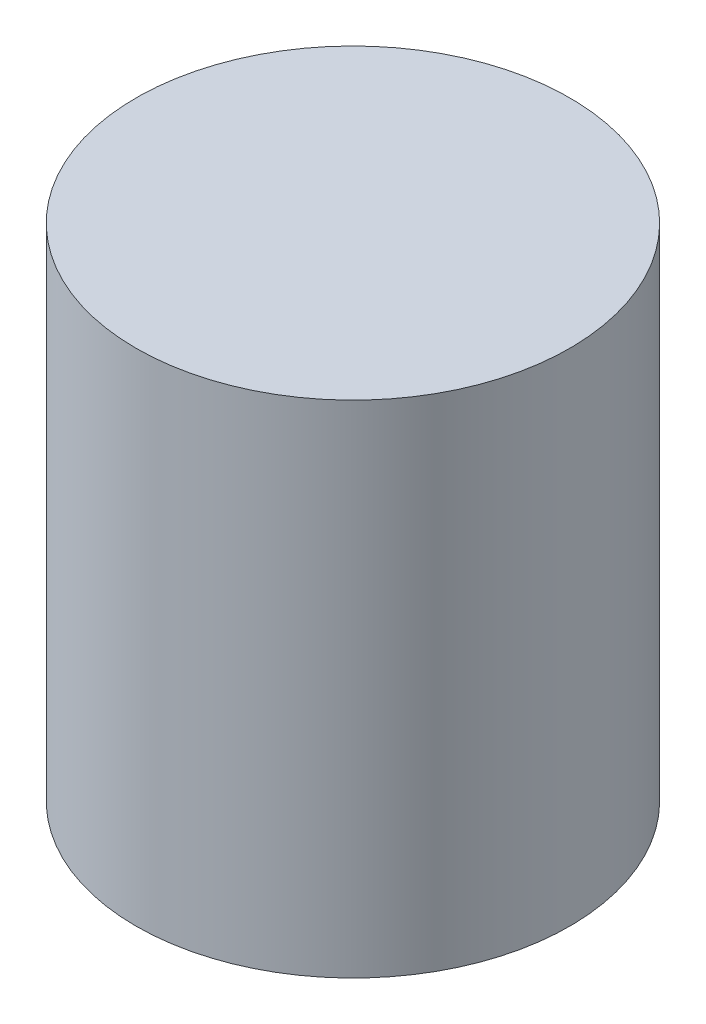
ISO-10303-21;
HEADER;
FILE_DESCRIPTION(('STEP AP214'),'2;1');
FILE_NAME('part.step','',(''),(''),'','','');
FILE_SCHEMA(('AUTOMOTIVE_DESIGN { 1 0 10303 214 1 1 1 1 }'));
ENDSEC;
DATA;
#1=APPLICATION_CONTEXT('core data for automotive mechanical design processes');
#2=APPLICATION_PROTOCOL_DEFINITION('international standard','automotive_design',2000,#1);
#3=PRODUCT_CONTEXT('',#1,'mechanical');
#4=PRODUCT('Part','Part','',(#3));
#5=PRODUCT_RELATED_PRODUCT_CATEGORY('part','',(#4));
#6=PRODUCT_DEFINITION_FORMATION('','',#4);
#7=PRODUCT_DEFINITION_CONTEXT('part definition',#1,'design');
#8=PRODUCT_DEFINITION('design','',#6,#7);
#9=PRODUCT_DEFINITION_SHAPE('','',#8);
#10=(LENGTH_UNIT() NAMED_UNIT(*) SI_UNIT(.MILLI.,.METRE.));
#11=(NAMED_UNIT(*) PLANE_ANGLE_UNIT() SI_UNIT($,.RADIAN.));
#12=(NAMED_UNIT(*) SI_UNIT($,.STERADIAN.) SOLID_ANGLE_UNIT());
#13=UNCERTAINTY_MEASURE_WITH_UNIT(LENGTH_MEASURE(1.E-05),#10,'distance_accuracy_value','');
#14=(GEOMETRIC_REPRESENTATION_CONTEXT(3) GLOBAL_UNCERTAINTY_ASSIGNED_CONTEXT((#13)) GLOBAL_UNIT_ASSIGNED_CONTEXT((#10,
#11,#12)) REPRESENTATION_CONTEXT('',''));
#15=CARTESIAN_POINT('',(0.,0.,0.));
#16=DIRECTION('',(0.,0.,1.));
#17=DIRECTION('',(1.,0.,0.));
#18=AXIS2_PLACEMENT_3D('',#15,#16,#17);
#19=CARTESIAN_POINT('',(0.,7.5,0.));
#20=DIRECTION('',(0.,1.,0.));
#21=DIRECTION('',(0.,0.,1.));
#22=AXIS2_PLACEMENT_3D('',#19,#20,#21);
#23=CYLINDRICAL_SURFACE('',#22,6.5);
#24=CARTESIAN_POINT('',(2.,0.,-6.18465843842649));
#25=CARTESIAN_POINT('',(1.9999990095568,0.109447816665231,-6.18465930196192));
#26=CARTESIAN_POINT('',(1.99098535833565,0.21890548483824,-6.18759551962699));
#27=CARTESIAN_POINT('',(1.95526805100872,0.434611181685205,-6.19897317486936));
#28=CARTESIAN_POINT('',(1.92855917969018,0.540858254462862,-6.20741623543611));
#29=CARTESIAN_POINT('',(1.85845185053105,0.746987807974041,-6.22876273970596));
#30=CARTESIAN_POINT('',(1.8150822317129,0.84688094075819,-6.24165847214778));
#31=CARTESIAN_POINT('',(1.71298018316394,1.03799985089879,-6.27044669026987));
#32=CARTESIAN_POINT('',(1.65424519824938,1.12922418323406,-6.28633967425533));
#33=CARTESIAN_POINT('',(1.52098542811858,1.30345356947201,-6.31992519486664));
#34=CARTESIAN_POINT('',(1.44603755808562,1.38612742349218,-6.33765756932836));
#35=CARTESIAN_POINT('',(1.2833853622474,1.53795371808371,-6.37258438430366));
#36=CARTESIAN_POINT('',(1.19567931401686,1.607104329982,-6.38977875180184));
#37=CARTESIAN_POINT('',(1.00762969104173,1.73137363799946,-6.4221466710909));
#38=CARTESIAN_POINT('',(0.9070517792467,1.78615256785287,-6.43726783390859));
#39=CARTESIAN_POINT('',(0.69756649861164,1.87788894200935,-6.46332130744831));
#40=CARTESIAN_POINT('',(0.588661031083088,1.91485044031837,-6.47425457092804));
#41=CARTESIAN_POINT('',(0.369078789668964,1.96880071461249,-6.49041842306583));
#42=CARTESIAN_POINT('',(0.258553108996817,1.98635527672199,-6.49581021502431));
#43=CARTESIAN_POINT('',(0.0360024805210013,2.00278460642675,-6.50085231846729));
#44=CARTESIAN_POINT('',(-0.0760221311138324,2.00166349455574,-6.50050389645219));
#45=CARTESIAN_POINT('',(-0.29441356422115,1.98114844527175,-6.49421773787331));
#46=CARTESIAN_POINT('',(-0.400844233271026,1.96236759529849,-6.48846753941673));
#47=CARTESIAN_POINT('',(-0.608962506037096,1.90807040958312,-6.47225351889556));
#48=CARTESIAN_POINT('',(-0.710649803253991,1.87255299402721,-6.46178939269855));
#49=CARTESIAN_POINT('',(-0.90782598395705,1.78538875658138,-6.43706860960458));
#50=CARTESIAN_POINT('',(-1.00322571036048,1.73355326091788,-6.42276789460409));
#51=CARTESIAN_POINT('',(-1.18416561152014,1.61537480759448,-6.39188462555487));
#52=CARTESIAN_POINT('',(-1.26970334400256,1.54902826808112,-6.37530150850161));
#53=CARTESIAN_POINT('',(-1.43214818143839,1.40055088932973,-6.34083036356049));
#54=CARTESIAN_POINT('',(-1.50856604633594,1.31789001491942,-6.32291668577951));
#55=CARTESIAN_POINT('',(-1.64659789158783,1.14075606067757,-6.28838540910676));
#56=CARTESIAN_POINT('',(-1.70821023726841,1.04628167826866,-6.27176795346722));
#57=CARTESIAN_POINT('',(-1.81542815284785,0.846856931756138,-6.24158384080898));
#58=CARTESIAN_POINT('',(-1.86085804249382,0.741806585219369,-6.22805120968131));
#59=CARTESIAN_POINT('',(-1.93323233909799,0.525031282670397,-6.20596978963966));
#60=CARTESIAN_POINT('',(-1.96018314804153,0.413308652834673,-6.19741927485069));
#61=CARTESIAN_POINT('',(-1.99390183839659,0.191035471845242,-6.18665163283591));
#62=CARTESIAN_POINT('',(-2.00141677206859,0.0806095197673063,-6.18420022355391));
#63=CARTESIAN_POINT('',(-1.99814331840788,-0.139931385960741,-6.18525890294931));
#64=CARTESIAN_POINT('',(-1.98735765434068,-0.250046383440874,-6.1887681046434));
#65=CARTESIAN_POINT('',(-1.94845591378718,-0.463662604739119,-6.20112183020873));
#66=CARTESIAN_POINT('',(-1.92082922102701,-0.567262569796857,-6.2098155474974));
#67=CARTESIAN_POINT('',(-1.84960144317458,-0.768346882088312,-6.23140033431748));
#68=CARTESIAN_POINT('',(-1.80599780585854,-0.865830249315515,-6.24429207442193));
#69=CARTESIAN_POINT('',(-1.70266083632212,-1.05493091163105,-6.27326823548526));
#70=CARTESIAN_POINT('',(-1.642510447689,-1.14630785213969,-6.28943187401987));
#71=CARTESIAN_POINT('',(-1.50827755720534,-1.31794354555123,-6.32296420859206));
#72=CARTESIAN_POINT('',(-1.43419154645756,-1.39819948940284,-6.34033320743476));
#73=CARTESIAN_POINT('',(-1.27066455897645,-1.54862457863678,-6.37515982745186));
#74=CARTESIAN_POINT('',(-1.18072798127102,-1.61826194770113,-6.39259321140603));
#75=CARTESIAN_POINT('',(-0.990026292988487,-1.74147403614338,-6.42488804988591));
#76=CARTESIAN_POINT('',(-0.889261696820769,-1.79504951811948,-6.43974962650362));
#77=CARTESIAN_POINT('',(-0.680404349890932,-1.88410110299942,-6.46513895511409));
#78=CARTESIAN_POINT('',(-0.572372332564448,-1.91971014160227,-6.47569842330933));
#79=CARTESIAN_POINT('',(-0.3514722088031,-1.97214176575569,-6.49143353701507));
#80=CARTESIAN_POINT('',(-0.238605575732809,-1.98897003310149,-6.49661081078227));
#81=CARTESIAN_POINT('',(-0.0161425784559034,-2.00291225061698,-6.50089371028741));
#82=CARTESIAN_POINT('',(0.0934015930792303,-2.00079549118373,-6.50023627237803));
#83=CARTESIAN_POINT('',(0.310503921550123,-1.9787598024948,-6.49348761016137));
#84=CARTESIAN_POINT('',(0.418062200881385,-1.95884197412687,-6.48739672187997));
#85=CARTESIAN_POINT('',(0.626896153328702,-1.90225418775621,-6.47053765408911));
#86=CARTESIAN_POINT('',(0.728231001104438,-1.86578475332313,-6.45982553572913));
#87=CARTESIAN_POINT('',(0.923394028801655,-1.77730936601677,-6.43482974334373));
#88=CARTESIAN_POINT('',(1.01722093754076,-1.72530078921078,-6.42054546619161));
#89=CARTESIAN_POINT('',(1.19809140790342,-1.60522526368093,-6.38931014060288));
#90=CARTESIAN_POINT('',(1.28480651115009,-1.536682666197,-6.37228632231703));
#91=CARTESIAN_POINT('',(1.44576009155785,-1.38633051048256,-6.33770998123227));
#92=CARTESIAN_POINT('',(1.51999487724007,-1.30451704095014,-6.32015730380927));
#93=CARTESIAN_POINT('',(1.65626040321864,-1.12682302385205,-6.28584951367575));
#94=CARTESIAN_POINT('',(1.71782754366812,-1.0305776448569,-6.26913756348218));
#95=CARTESIAN_POINT('',(1.82384213502379,-0.828609246527145,-6.23912274318891));
#96=CARTESIAN_POINT('',(1.86829702453285,-0.722890369964196,-6.22581839266759));
#97=CARTESIAN_POINT('',(1.93528263381638,-0.515211801799422,-6.20530356949791));
#98=CARTESIAN_POINT('',(1.95948210366415,-0.413833688791695,-6.19763764909695));
#99=CARTESIAN_POINT('',(1.99183943194677,-0.20830626698363,-6.18731524290854));
#100=CARTESIAN_POINT('',(2.00000094256957,-0.104157594575678,-6.18465761663054));
#101=CARTESIAN_POINT('',(2.,0.,-6.18465843842649));
#102=B_SPLINE_CURVE_WITH_KNOTS('',3,(#24,#25,#26,#27,#28,#29,#30,#31,#32,#33,#34,#35,#36,#37,
#38,#39,#40,#41,#42,#43,#44,#45,#46,#47,#48,#49,#50,#51,#52,#53,#54,#55,#56,#57,#58,#59,#60,#61,
#62,#63,#64,#65,#66,#67,#68,#69,#70,#71,#72,#73,#74,#75,#76,#77,#78,#79,#80,#81,#82,#83,#84,#85,
#86,#87,#88,#89,#90,#91,#92,#93,#94,#95,#96,#97,#98,#99,#100,#101),.UNSPECIFIED.,.T.,.F.,(4,2,2,
2,2,2,2,2,2,2,2,2,2,2,2,2,2,2,2,2,2,2,2,2,2,2,2,2,2,2,2,2,2,2,2,2,2,2,4),(0.,0.32795890482453,
0.656014510157334,0.983504805826268,1.31104959615494,1.64848092871026,1.9859578587312,
2.33081172384083,2.67558708716039,3.01002171776409,3.34438256088806,3.66754797200326,
3.9907342360384,4.31780371544651,4.64495401879589,4.98534121479608,5.32576597561373,
5.66978125697087,6.01367729564791,6.34414407424119,6.6745616812246,6.99580726669394,
7.31710419166199,7.64738828171958,7.97775564671482,8.32133560221228,8.66489924238099,
9.00588210329356,9.34676177779275,9.67386437135672,10.0009467370162,10.3241681048257,
10.6474440825282,10.9814486359996,11.3155518095369,11.6602881883484,12.0048745424384,
12.3170524660658,12.6291592918299),.UNSPECIFIED.);
#103=CARTESIAN_POINT('',(2.,0.,-6.18465843842649));
#104=VERTEX_POINT('',#103);
#105=EDGE_CURVE('E58',#104,#104,#102,.T.);
#106=ORIENTED_EDGE('',*,*,#105,.T.);
#107=EDGE_LOOP('',(#106));
#108=FACE_BOUND('',#107,.T.);
#109=CARTESIAN_POINT('',(0.,7.5,0.));
#110=DIRECTION('',(0.,1.,0.));
#111=DIRECTION('',(0.,0.,1.));
#112=AXIS2_PLACEMENT_3D('',#109,#110,#111);
#113=CIRCLE('',#112,6.5);
#114=CARTESIAN_POINT('',(0.,7.5,6.5));
#115=VERTEX_POINT('',#114);
#116=EDGE_CURVE('E48',#115,#115,#113,.T.);
#117=ORIENTED_EDGE('',*,*,#116,.F.);
#118=EDGE_LOOP('',(#117));
#119=FACE_BOUND('',#118,.T.);
#120=CARTESIAN_POINT('',(0.,-7.5,0.));
#121=DIRECTION('',(0.,1.,0.));
#122=DIRECTION('',(0.,0.,1.));
#123=AXIS2_PLACEMENT_3D('',#120,#121,#122);
#124=CIRCLE('',#123,6.5);
#125=CARTESIAN_POINT('',(0.,-7.5,6.5));
#126=VERTEX_POINT('',#125);
#127=EDGE_CURVE('E10',#126,#126,#124,.T.);
#128=ORIENTED_EDGE('',*,*,#127,.T.);
#129=EDGE_LOOP('',(#128));
#130=FACE_BOUND('',#129,.T.);
#131=ADVANCED_FACE('F35',(#108,#119,#130),#23,.T.);
#132=CARTESIAN_POINT('',(0.,-7.5,0.));
#133=DIRECTION('',(0.,1.,0.));
#134=DIRECTION('',(0.,0.,1.));
#135=AXIS2_PLACEMENT_3D('',#132,#133,#134);
#136=PLANE('',#135);
#137=CARTESIAN_POINT('',(0.,-7.5,0.));
#138=DIRECTION('',(0.,-1.,0.));
#139=DIRECTION('',(0.,0.,-1.));
#140=AXIS2_PLACEMENT_3D('',#137,#138,#139);
#141=CIRCLE('',#140,4.5);
#142=CARTESIAN_POINT('',(0.,-7.5,-4.5));
#143=VERTEX_POINT('',#142);
#144=EDGE_CURVE('E55',#143,#143,#141,.T.);
#145=ORIENTED_EDGE('',*,*,#144,.F.);
#146=EDGE_LOOP('',(#145));
#147=FACE_BOUND('',#146,.T.);
#148=ORIENTED_EDGE('',*,*,#127,.F.);
#149=EDGE_LOOP('',(#148));
#150=FACE_BOUND('',#149,.T.);
#151=ADVANCED_FACE('F81',(#147,#150),#136,.F.);
#152=CARTESIAN_POINT('',(0.,7.5,0.));
#153=DIRECTION('',(0.,-1.,0.));
#154=DIRECTION('',(0.,0.,-1.));
#155=AXIS2_PLACEMENT_3D('',#152,#153,#154);
#156=PLANE('',#155);
#157=ORIENTED_EDGE('',*,*,#116,.T.);
#158=EDGE_LOOP('',(#157));
#159=FACE_BOUND('',#158,.T.);
#160=ADVANCED_FACE('F78',(#159),#156,.F.);
#161=CARTESIAN_POINT('',(0.,5.5,0.));
#162=DIRECTION('',(0.,-1.,0.));
#163=DIRECTION('',(0.,0.,-1.));
#164=AXIS2_PLACEMENT_3D('',#161,#162,#163);
#165=CYLINDRICAL_SURFACE('',#164,4.5);
#166=CARTESIAN_POINT('',(0.,2.,-4.5));
#167=CARTESIAN_POINT('',(0.106491721841544,1.99999501758122,-4.49999592201235));
#168=CARTESIAN_POINT('',(0.21314990839859,1.9914445549547,-4.49617759862479));
#169=CARTESIAN_POINT('',(0.423397791553031,1.95758155510822,-4.48128347117207));
#170=CARTESIAN_POINT('',(0.526979488674809,1.93222874127921,-4.4701902292036));
#171=CARTESIAN_POINT('',(0.727700457039997,1.86589953450088,-4.44192390608473));
#172=CARTESIAN_POINT('',(0.824861278500742,1.82497888321389,-4.4247725319732));
#173=CARTESIAN_POINT('',(1.01083182992513,1.72892471805294,-4.38602940690416));
#174=CARTESIAN_POINT('',(1.09964345718941,1.67379444393081,-4.36443866833523));
#175=CARTESIAN_POINT('',(1.27147987858137,1.54766515992118,-4.31759990391248));
#176=CARTESIAN_POINT('',(1.35398160775403,1.47600235690455,-4.29222181537651));
#177=CARTESIAN_POINT('',(1.50625667860228,1.32025173671296,-4.24118529786287));
#178=CARTESIAN_POINT('',(1.57602243299506,1.23615656675937,-4.21552671136583));
#179=CARTESIAN_POINT('',(1.70484606406972,1.05206127800161,-4.16516047349691));
#180=CARTESIAN_POINT('',(1.76305311381034,0.951423185684186,-4.14059326444591));
#181=CARTESIAN_POINT('',(1.86148058259834,0.740544753093485,-4.09729211094913));
#182=CARTESIAN_POINT('',(1.90171150191227,0.630310063495299,-4.07855476309651));
#183=CARTESIAN_POINT('',(1.96081152395391,0.409379619579217,-4.05046224857976));
#184=CARTESIAN_POINT('',(1.98069316967171,0.299013265598073,-4.04066532542944));
#185=CARTESIAN_POINT('',(2.00167828313022,0.0761102298353488,-4.03031463933106));
#186=CARTESIAN_POINT('',(2.00279429210704,-0.0364249521422935,-4.02975470323001));
#187=CARTESIAN_POINT('',(1.98697164299089,-0.249695448629339,-4.03757276711961));
#188=CARTESIAN_POINT('',(1.97164003901053,-0.350585369169931,-4.04515525710506));
#189=CARTESIAN_POINT('',(1.92608101262575,-0.548175224956341,-4.06704362044732));
#190=CARTESIAN_POINT('',(1.89585024271053,-0.644874213278739,-4.08135100470464));
#191=CARTESIAN_POINT('',(1.82075207125291,-0.833933627731914,-4.11540857141477));
#192=CARTESIAN_POINT('',(1.77557135736335,-0.926147945140864,-4.13527371795058));
#193=CARTESIAN_POINT('',(1.67208117489408,-1.10207591447439,-4.1781907832441));
#194=CARTESIAN_POINT('',(1.61376617867147,-1.18578596574057,-4.20124404215704));
#195=CARTESIAN_POINT('',(1.47900808503927,-1.35091360147711,-4.25066638916311));
#196=CARTESIAN_POINT('',(1.40135242758352,-1.4313134784174,-4.2771397203327));
#197=CARTESIAN_POINT('',(1.23343821212405,-1.57831744355736,-4.32854899612318));
#198=CARTESIAN_POINT('',(1.14317585772422,-1.64491736095991,-4.3534844743602));
#199=CARTESIAN_POINT('',(0.949152758511855,-1.76421322772203,-4.39992448973313));
#200=CARTESIAN_POINT('',(0.845072037598961,-1.81644034319335,-4.42130591930767));
#201=CARTESIAN_POINT('',(0.628407422866469,-1.90227694991218,-4.45725580673344));
#202=CARTESIAN_POINT('',(0.515828940708059,-1.93589817822298,-4.47182855876463));
#203=CARTESIAN_POINT('',(0.293820535494529,-1.98131188268605,-4.4916825843904));
#204=CARTESIAN_POINT('',(0.184721163041698,-1.99446669725098,-4.49754246102964));
#205=CARTESIAN_POINT('',(-0.0342770387909806,-2.00270312306883,-4.5012000386526));
#206=CARTESIAN_POINT('',(-0.144175583963882,-1.99779087313499,-4.49900047806663));
#207=CARTESIAN_POINT('',(-0.354907416738486,-1.97095642731917,-4.48715295545649));
#208=CARTESIAN_POINT('',(-0.455896417732648,-1.95003910748051,-4.47794517757649));
#209=CARTESIAN_POINT('',(-0.652792072958491,-1.89324202089695,-4.45350542314086));
#210=CARTESIAN_POINT('',(-0.748698107925825,-1.85736043573746,-4.43827271446453));
#211=CARTESIAN_POINT('',(-0.936104051933312,-1.7705111175896,-4.40262377340665));
#212=CARTESIAN_POINT('',(-1.02737315333644,-1.71910765288565,-4.38206065228313));
#213=CARTESIAN_POINT('',(-1.20031927875007,-1.60314857398209,-4.33788123051324));
#214=CARTESIAN_POINT('',(-1.28199210078392,-1.53858723185455,-4.31426360181097));
#215=CARTESIAN_POINT('',(-1.44036721253598,-1.39208322020143,-4.26412793153243));
#216=CARTESIAN_POINT('',(-1.51613838739789,-1.30915906251989,-4.23752954099254));
#217=CARTESIAN_POINT('',(-1.65300242266304,-1.13144465968409,-4.18604134951667));
#218=CARTESIAN_POINT('',(-1.71409007929176,-1.03665022580463,-4.16115215653839));
#219=CARTESIAN_POINT('',(-1.8210757313739,-0.834875692192252,-4.11547790156447));
#220=CARTESIAN_POINT('',(-1.86658327729173,-0.72766168363668,-4.09480296069983));
#221=CARTESIAN_POINT('',(-1.9384649201629,-0.505873184690499,-4.06127502800889));
#222=CARTESIAN_POINT('',(-1.96485774363289,-0.39130601826933,-4.04841438258477));
#223=CARTESIAN_POINT('',(-1.9957854782711,-0.168518423822214,-4.03325053556432));
#224=CARTESIAN_POINT('',(-2.00198344684389,-0.0605831214727556,-4.03014488230275));
#225=CARTESIAN_POINT('',(-1.99690774864711,0.154759603201472,-4.03266289201163));
#226=CARTESIAN_POINT('',(-1.9856378074246,0.262167133188311,-4.03828469359531));
#227=CARTESIAN_POINT('',(-1.94740226605599,0.466691927265753,-4.056849647764));
#228=CARTESIAN_POINT('',(-1.92142172220812,0.564039519045747,-4.06933199333214));
#229=CARTESIAN_POINT('',(-1.85554194393926,0.75298191903924,-4.09978946876219));
#230=CARTESIAN_POINT('',(-1.81563868559956,0.844575055069018,-4.11776618641145));
#231=CARTESIAN_POINT('',(-1.72012109921673,1.02583760828885,-4.15861055539882));
#232=CARTESIAN_POINT('',(-1.66366385858237,1.11500764977681,-4.18171780090031));
#233=CARTESIAN_POINT('',(-1.53773594407697,1.28312481334675,-4.22964589951755));
#234=CARTESIAN_POINT('',(-1.46825983476651,1.36206764215037,-4.25446746562723));
#235=CARTESIAN_POINT('',(-1.31108140365533,1.51462241319819,-4.30563232874031));
#236=CARTESIAN_POINT('',(-1.22231636253249,1.58716396303647,-4.33191880579014));
#237=CARTESIAN_POINT('',(-1.03295134905358,1.71643521702798,-4.38093190708684));
#238=CARTESIAN_POINT('',(-0.93234599993672,1.77315769793594,-4.40365690303547));
#239=CARTESIAN_POINT('',(-0.72305182329237,1.86822386265644,-4.44279207455561));
#240=CARTESIAN_POINT('',(-0.614467261766122,1.90676811008318,-4.45927074863036));
#241=CARTESIAN_POINT('',(-0.391615018990366,1.96463975047681,-4.48431907433046));
#242=CARTESIAN_POINT('',(-0.277365804280792,1.98402576384635,-4.49291284638178));
#243=CARTESIAN_POINT('',(-0.135356670708528,1.9955997263474,-4.4980461865859));
#244=CARTESIAN_POINT('',(-0.108319935768286,1.99724828858674,-4.49877760770441));
#245=CARTESIAN_POINT('',(-0.0541923948081839,1.99944906578034,-4.49975503614401));
#246=CARTESIAN_POINT('',(-0.0271015881639021,2.00000126799961,-4.5000010378266));
#247=CARTESIAN_POINT('',(0.,2.,-4.5));
#248=B_SPLINE_CURVE_WITH_KNOTS('',3,(#166,#167,#168,#169,#170,#171,#172,#173,#174,#175,#176,
#177,#178,#179,#180,#181,#182,#183,#184,#185,#186,#187,#188,#189,#190,#191,#192,#193,#194,#195,
#196,#197,#198,#199,#200,#201,#202,#203,#204,#205,#206,#207,#208,#209,#210,#211,#212,#213,#214,
#215,#216,#217,#218,#219,#220,#221,#222,#223,#224,#225,#226,#227,#228,#229,#230,#231,#232,#233,
#234,#235,#236,#237,#238,#239,#240,#241,#242,#243,#244,#245,#246,#247),.UNSPECIFIED.,.T.,.F.,(4,
2,2,2,2,2,2,2,2,2,2,2,2,2,2,2,2,2,2,2,2,2,2,2,2,2,2,2,2,2,2,2,2,2,2,2,2,2,2,2,4),(0.,
0.319363757820221,0.639495839039848,0.958492293098602,1.27741608114944,1.61253910860028,
1.94786113409909,2.30254396540811,2.65701934670053,2.99284475492684,3.32844571922349,
3.63400850030665,3.93963996586078,4.25213185320657,4.56475550123122,4.90783346749842,
5.25101497234173,5.60433395902649,5.95742980836632,6.28582812976761,6.61411487855049,
6.92332786204155,7.23257843116074,7.5514769554366,7.87051460127432,8.2152651666866,
8.56013773064321,8.91311015646709,9.26573630896652,9.58847399859333,9.91114286435878,
10.214399649514,10.5177441541184,10.8405269704428,11.1634448516016,11.5146101835415,
11.8659356017472,12.2132884514089,12.5595751486184,12.6408506163643,12.7221270281759),.UNSPECIFIED.);
#249=CARTESIAN_POINT('',(0.,2.,-4.5));
#250=VERTEX_POINT('',#249);
#251=EDGE_CURVE('E39',#250,#250,#248,.T.);
#252=ORIENTED_EDGE('',*,*,#251,.T.);
#253=EDGE_LOOP('',(#252));
#254=FACE_BOUND('',#253,.T.);
#255=CARTESIAN_POINT('',(0.,5.5,0.));
#256=DIRECTION('',(0.,-1.,0.));
#257=DIRECTION('',(0.,0.,-1.));
#258=AXIS2_PLACEMENT_3D('',#255,#256,#257);
#259=CIRCLE('',#258,4.5);
#260=CARTESIAN_POINT('',(0.,5.5,-4.5));
#261=VERTEX_POINT('',#260);
#262=EDGE_CURVE('E52',#261,#261,#259,.T.);
#263=ORIENTED_EDGE('',*,*,#262,.F.);
#264=EDGE_LOOP('',(#263));
#265=FACE_BOUND('',#264,.T.);
#266=ORIENTED_EDGE('',*,*,#144,.T.);
#267=EDGE_LOOP('',(#266));
#268=FACE_BOUND('',#267,.T.);
#269=ADVANCED_FACE('F73',(#254,#265,#268),#165,.F.);
#270=CARTESIAN_POINT('',(0.,5.5,0.));
#271=DIRECTION('',(0.,-1.,0.));
#272=DIRECTION('',(0.,0.,-1.));
#273=AXIS2_PLACEMENT_3D('',#270,#271,#272);
#274=PLANE('',#273);
#275=ORIENTED_EDGE('',*,*,#262,.T.);
#276=EDGE_LOOP('',(#275));
#277=FACE_BOUND('',#276,.T.);
#278=ADVANCED_FACE('F69',(#277),#274,.T.);
#279=CARTESIAN_POINT('',(0.,0.,-13.));
#280=DIRECTION('',(0.,0.,1.));
#281=DIRECTION('',(1.,0.,0.));
#282=AXIS2_PLACEMENT_3D('',#279,#280,#281);
#283=CYLINDRICAL_SURFACE('',#282,2.);
#284=ORIENTED_EDGE('',*,*,#251,.F.);
#285=EDGE_LOOP('',(#284));
#286=FACE_BOUND('',#285,.T.);
#287=ORIENTED_EDGE('',*,*,#105,.F.);
#288=EDGE_LOOP('',(#287));
#289=FACE_BOUND('',#288,.T.);
#290=ADVANCED_FACE('F65',(#286,#289),#283,.F.);
#291=CLOSED_SHELL('',(#131,#151,#160,#269,#278,#290));
#292=MANIFOLD_SOLID_BREP('B2',#291);
#293=ADVANCED_BREP_SHAPE_REPRESENTATION('',(#18,#292),#14);
#294=SHAPE_DEFINITION_REPRESENTATION(#9,#293);
ENDSEC;
END-ISO-10303-21;
